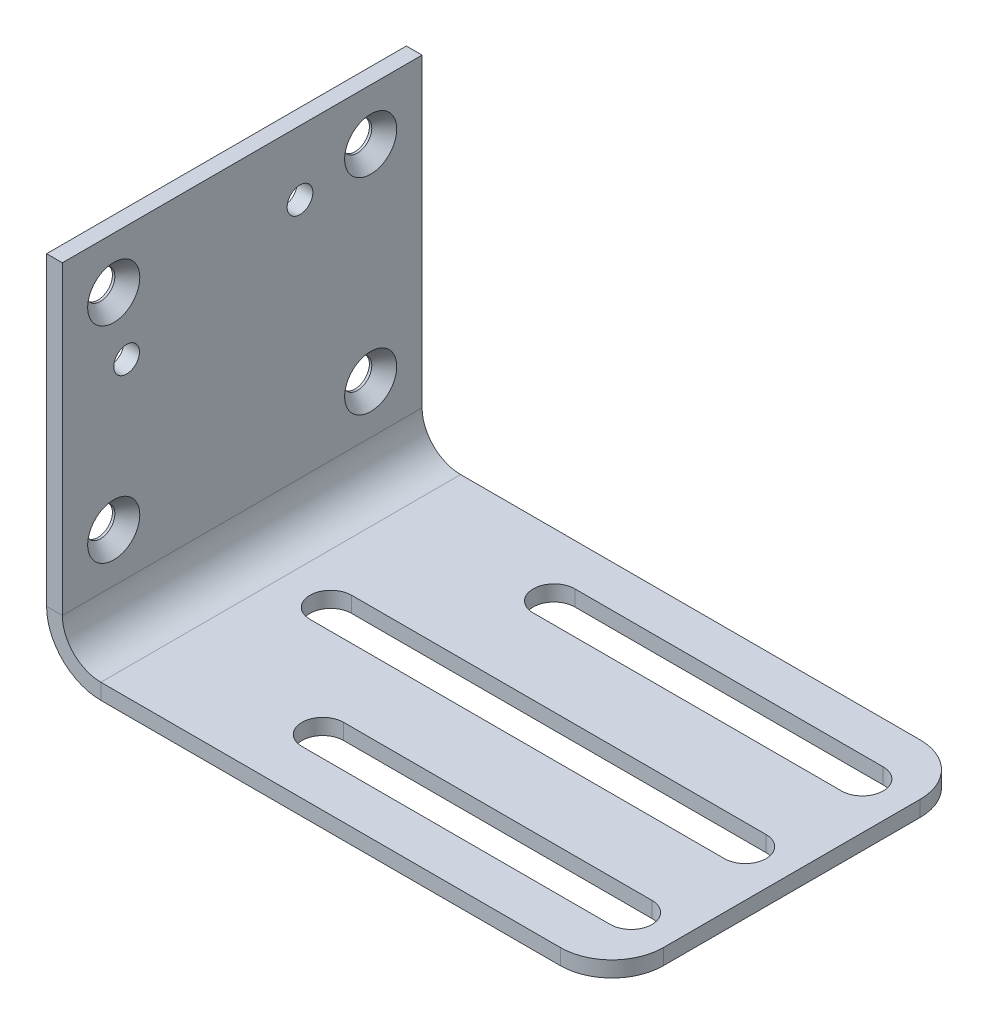
ISO-10303-21;
HEADER;
FILE_DESCRIPTION(('STEP AP214'),'2;1');
FILE_NAME('part.step','',(''),(''),'','','');
FILE_SCHEMA(('AUTOMOTIVE_DESIGN { 1 0 10303 214 1 1 1 1 }'));
ENDSEC;
DATA;
#1=APPLICATION_CONTEXT('core data for automotive mechanical design processes');
#2=APPLICATION_PROTOCOL_DEFINITION('international standard','automotive_design',2000,#1);
#3=PRODUCT_CONTEXT('',#1,'mechanical');
#4=PRODUCT('Part','Part','',(#3));
#5=PRODUCT_RELATED_PRODUCT_CATEGORY('part','',(#4));
#6=PRODUCT_DEFINITION_FORMATION('','',#4);
#7=PRODUCT_DEFINITION_CONTEXT('part definition',#1,'design');
#8=PRODUCT_DEFINITION('design','',#6,#7);
#9=PRODUCT_DEFINITION_SHAPE('','',#8);
#10=(LENGTH_UNIT() NAMED_UNIT(*) SI_UNIT(.MILLI.,.METRE.));
#11=(NAMED_UNIT(*) PLANE_ANGLE_UNIT() SI_UNIT($,.RADIAN.));
#12=(NAMED_UNIT(*) SI_UNIT($,.STERADIAN.) SOLID_ANGLE_UNIT());
#13=UNCERTAINTY_MEASURE_WITH_UNIT(LENGTH_MEASURE(1.E-05),#10,'distance_accuracy_value','');
#14=(GEOMETRIC_REPRESENTATION_CONTEXT(3) GLOBAL_UNCERTAINTY_ASSIGNED_CONTEXT((#13)) GLOBAL_UNIT_ASSIGNED_CONTEXT((#10,
#11,#12)) REPRESENTATION_CONTEXT('',''));
#15=CARTESIAN_POINT('',(0.,0.,0.));
#16=DIRECTION('',(0.,0.,1.));
#17=DIRECTION('',(1.,0.,0.));
#18=AXIS2_PLACEMENT_3D('',#15,#16,#17);
#19=CARTESIAN_POINT('',(0.,13.41628,44.45));
#20=DIRECTION('',(0.,0.,1.));
#21=DIRECTION('',(1.,0.,0.));
#22=AXIS2_PLACEMENT_3D('',#19,#20,#21);
#23=PLANE('',#22);
#24=DIRECTION('',(1.,0.,0.));
#25=VECTOR('',#24,1.);
#26=CARTESIAN_POINT('',(0.,13.41628,44.45));
#27=LINE('',#26,#25);
#28=CARTESIAN_POINT('',(0.,13.41628,44.45));
#29=VERTEX_POINT('',#28);
#30=CARTESIAN_POINT('',(3.89128,13.41628,44.45));
#31=VERTEX_POINT('',#30);
#32=EDGE_CURVE('E370',#29,#31,#27,.T.);
#33=ORIENTED_EDGE('',*,*,#32,.F.);
#34=CARTESIAN_POINT('',(13.41628,13.41628,44.45));
#35=DIRECTION('',(0.,0.,-1.));
#36=DIRECTION('',(-1.,0.,0.));
#37=AXIS2_PLACEMENT_3D('',#34,#35,#36);
#38=CIRCLE('',#37,13.41628);
#39=CARTESIAN_POINT('',(13.41628,0.,44.45));
#40=VERTEX_POINT('',#39);
#41=EDGE_CURVE('E322',#29,#40,#38,.F.);
#42=ORIENTED_EDGE('',*,*,#41,.T.);
#43=DIRECTION('',(0.,-1.,0.));
#44=VECTOR('',#43,1.);
#45=CARTESIAN_POINT('',(13.41628,3.89128,44.45));
#46=LINE('',#45,#44);
#47=CARTESIAN_POINT('',(13.41628,3.89128,44.45));
#48=VERTEX_POINT('',#47);
#49=EDGE_CURVE('E368',#48,#40,#46,.T.);
#50=ORIENTED_EDGE('',*,*,#49,.F.);
#51=CARTESIAN_POINT('',(13.41628,13.41628,44.45));
#52=DIRECTION('',(0.,0.,1.));
#53=DIRECTION('',(1.,0.,0.));
#54=AXIS2_PLACEMENT_3D('',#51,#52,#53);
#55=CIRCLE('',#54,9.525);
#56=EDGE_CURVE('E310',#31,#48,#55,.T.);
#57=ORIENTED_EDGE('',*,*,#56,.F.);
#58=EDGE_LOOP('',(#33,#42,#50,#57));
#59=FACE_BOUND('',#58,.T.);
#60=ADVANCED_FACE('F43',(#59),#23,.T.);
#61=CARTESIAN_POINT('',(13.41628,3.89128,44.45));
#62=DIRECTION('',(0.,0.,1.));
#63=DIRECTION('',(1.,0.,0.));
#64=AXIS2_PLACEMENT_3D('',#61,#62,#63);
#65=PLANE('',#64);
#66=DIRECTION('',(0.,-1.,0.));
#67=VECTOR('',#66,1.);
#68=CARTESIAN_POINT('',(0.,0.,44.45));
#69=LINE('',#68,#67);
#70=CARTESIAN_POINT('',(0.,88.9,44.45));
#71=VERTEX_POINT('',#70);
#72=EDGE_CURVE('E319',#71,#29,#69,.T.);
#73=ORIENTED_EDGE('',*,*,#72,.T.);
#74=ORIENTED_EDGE('',*,*,#32,.T.);
#75=DIRECTION('',(0.,1.,0.));
#76=VECTOR('',#75,1.);
#77=CARTESIAN_POINT('',(3.89128,0.,44.45));
#78=LINE('',#77,#76);
#79=CARTESIAN_POINT('',(3.89128,88.9,44.45));
#80=VERTEX_POINT('',#79);
#81=EDGE_CURVE('E313',#80,#31,#78,.F.);
#82=ORIENTED_EDGE('',*,*,#81,.F.);
#83=DIRECTION('',(1.,0.,0.));
#84=VECTOR('',#83,1.);
#85=CARTESIAN_POINT('',(0.,88.9,44.45));
#86=LINE('',#85,#84);
#87=EDGE_CURVE('E316',#71,#80,#86,.T.);
#88=ORIENTED_EDGE('',*,*,#87,.F.);
#89=EDGE_LOOP('',(#73,#74,#82,#88));
#90=FACE_BOUND('',#89,.T.);
#91=ADVANCED_FACE('F446',(#90),#65,.T.);
#92=CARTESIAN_POINT('',(13.41628,0.,-44.45));
#93=DIRECTION('',(0.,0.,-1.));
#94=DIRECTION('',(-1.,0.,0.));
#95=AXIS2_PLACEMENT_3D('',#92,#93,#94);
#96=PLANE('',#95);
#97=DIRECTION('',(0.,1.,0.));
#98=VECTOR('',#97,1.);
#99=CARTESIAN_POINT('',(13.41628,0.,-44.45));
#100=LINE('',#99,#98);
#101=CARTESIAN_POINT('',(13.41628,0.,-44.45));
#102=VERTEX_POINT('',#101);
#103=CARTESIAN_POINT('',(13.41628,3.89128,-44.45));
#104=VERTEX_POINT('',#103);
#105=EDGE_CURVE('E366',#102,#104,#100,.T.);
#106=ORIENTED_EDGE('',*,*,#105,.F.);
#107=CARTESIAN_POINT('',(13.41628,13.41628,-44.45));
#108=DIRECTION('',(0.,0.,-1.));
#109=DIRECTION('',(-1.,0.,0.));
#110=AXIS2_PLACEMENT_3D('',#107,#108,#109);
#111=CIRCLE('',#110,13.41628);
#112=CARTESIAN_POINT('',(0.,13.41628,-44.45));
#113=VERTEX_POINT('',#112);
#114=EDGE_CURVE('E308',#113,#102,#111,.F.);
#115=ORIENTED_EDGE('',*,*,#114,.F.);
#116=DIRECTION('',(-1.,0.,0.));
#117=VECTOR('',#116,1.);
#118=CARTESIAN_POINT('',(3.89128,13.41628,-44.45));
#119=LINE('',#118,#117);
#120=CARTESIAN_POINT('',(3.89128,13.41628,-44.45));
#121=VERTEX_POINT('',#120);
#122=EDGE_CURVE('E364',#121,#113,#119,.T.);
#123=ORIENTED_EDGE('',*,*,#122,.F.);
#124=CARTESIAN_POINT('',(13.41628,13.41628,-44.45));
#125=DIRECTION('',(0.,0.,1.));
#126=DIRECTION('',(1.,0.,0.));
#127=AXIS2_PLACEMENT_3D('',#124,#125,#126);
#128=CIRCLE('',#127,9.525);
#129=EDGE_CURVE('E331',#121,#104,#128,.T.);
#130=ORIENTED_EDGE('',*,*,#129,.T.);
#131=EDGE_LOOP('',(#106,#115,#123,#130));
#132=FACE_BOUND('',#131,.T.);
#133=ADVANCED_FACE('F430',(#132),#96,.T.);
#134=CARTESIAN_POINT('',(3.89128,13.41628,-44.45));
#135=DIRECTION('',(0.,0.,-1.));
#136=DIRECTION('',(-1.,0.,0.));
#137=AXIS2_PLACEMENT_3D('',#134,#135,#136);
#138=PLANE('',#137);
#139=DIRECTION('',(1.,0.,0.));
#140=VECTOR('',#139,1.);
#141=CARTESIAN_POINT('',(0.,3.89128,-44.45));
#142=LINE('',#141,#140);
#143=CARTESIAN_POINT('',(127.,3.89128,-44.45));
#144=VERTEX_POINT('',#143);
#145=EDGE_CURVE('E328',#104,#144,#142,.T.);
#146=ORIENTED_EDGE('',*,*,#145,.T.);
#147=DIRECTION('',(0.,-1.,0.));
#148=VECTOR('',#147,1.);
#149=CARTESIAN_POINT('',(127.,13.4162800000018,-44.45));
#150=LINE('',#149,#148);
#151=CARTESIAN_POINT('',(127.,0.,-44.45));
#152=VERTEX_POINT('',#151);
#153=EDGE_CURVE('E390',#144,#152,#150,.T.);
#154=ORIENTED_EDGE('',*,*,#153,.T.);
#155=DIRECTION('',(1.,0.,0.));
#156=VECTOR('',#155,1.);
#157=CARTESIAN_POINT('',(0.,0.,-44.45));
#158=LINE('',#157,#156);
#159=EDGE_CURVE('E298',#102,#152,#158,.T.);
#160=ORIENTED_EDGE('',*,*,#159,.F.);
#161=ORIENTED_EDGE('',*,*,#105,.T.);
#162=EDGE_LOOP('',(#146,#154,#160,#161));
#163=FACE_BOUND('',#162,.T.);
#164=ADVANCED_FACE('F410',(#163),#138,.T.);
#165=CARTESIAN_POINT('',(0.,0.,44.45));
#166=DIRECTION('',(0.,1.,0.));
#167=DIRECTION('',(0.,0.,1.));
#168=AXIS2_PLACEMENT_3D('',#165,#166,#167);
#169=PLANE('',#168);
#170=DIRECTION('',(-1.,0.,0.));
#171=VECTOR('',#170,1.);
#172=CARTESIAN_POINT('',(51.9937999999999,0.,-34.1122));
#173=LINE('',#172,#171);
#174=CARTESIAN_POINT('',(128.1938,0.,-34.1122));
#175=VERTEX_POINT('',#174);
#176=CARTESIAN_POINT('',(51.9937999999999,0.,-34.1122));
#177=VERTEX_POINT('',#176);
#178=EDGE_CURVE('E206',#175,#177,#173,.T.);
#179=ORIENTED_EDGE('',*,*,#178,.T.);
#180=CARTESIAN_POINT('',(51.9937999999999,0.,-28.956));
#181=DIRECTION('',(0.,1.,0.));
#182=DIRECTION('',(0.,0.,1.));
#183=AXIS2_PLACEMENT_3D('',#180,#181,#182);
#184=CIRCLE('',#183,5.1562);
#185=CARTESIAN_POINT('',(51.9937999999999,0.,-23.7998));
#186=VERTEX_POINT('',#185);
#187=EDGE_CURVE('E198',#177,#186,#184,.T.);
#188=ORIENTED_EDGE('',*,*,#187,.T.);
#189=DIRECTION('',(1.,0.,0.));
#190=VECTOR('',#189,1.);
#191=CARTESIAN_POINT('',(51.9937999999999,0.,-23.7998));
#192=LINE('',#191,#190);
#193=CARTESIAN_POINT('',(128.1938,0.,-23.7998));
#194=VERTEX_POINT('',#193);
#195=EDGE_CURVE('E210',#186,#194,#192,.T.);
#196=ORIENTED_EDGE('',*,*,#195,.T.);
#197=CARTESIAN_POINT('',(128.1938,0.,-28.956));
#198=DIRECTION('',(0.,1.,0.));
#199=DIRECTION('',(0.,0.,1.));
#200=AXIS2_PLACEMENT_3D('',#197,#198,#199);
#201=CIRCLE('',#200,5.1562);
#202=EDGE_CURVE('E214',#194,#175,#201,.T.);
#203=ORIENTED_EDGE('',*,*,#202,.T.);
#204=EDGE_LOOP('',(#179,#188,#196,#203));
#205=FACE_BOUND('',#204,.T.);
#206=DIRECTION('',(-1.,0.,0.));
#207=VECTOR('',#206,1.);
#208=CARTESIAN_POINT('',(51.9937999999999,0.,23.0378));
#209=LINE('',#208,#207);
#210=CARTESIAN_POINT('',(128.1938,0.,23.0378));
#211=VERTEX_POINT('',#210);
#212=CARTESIAN_POINT('',(51.9937999999999,0.,23.0378));
#213=VERTEX_POINT('',#212);
#214=EDGE_CURVE('E251',#211,#213,#209,.T.);
#215=ORIENTED_EDGE('',*,*,#214,.T.);
#216=CARTESIAN_POINT('',(51.9937999999999,0.,28.194));
#217=DIRECTION('',(0.,1.,0.));
#218=DIRECTION('',(0.,0.,1.));
#219=AXIS2_PLACEMENT_3D('',#216,#217,#218);
#220=CIRCLE('',#219,5.1562);
#221=CARTESIAN_POINT('',(51.9937999999999,0.,33.3502));
#222=VERTEX_POINT('',#221);
#223=EDGE_CURVE('E241',#213,#222,#220,.T.);
#224=ORIENTED_EDGE('',*,*,#223,.T.);
#225=DIRECTION('',(1.,0.,0.));
#226=VECTOR('',#225,1.);
#227=CARTESIAN_POINT('',(51.9937999999999,0.,33.3502));
#228=LINE('',#227,#226);
#229=CARTESIAN_POINT('',(128.1938,0.,33.3502));
#230=VERTEX_POINT('',#229);
#231=EDGE_CURVE('E244',#222,#230,#228,.T.);
#232=ORIENTED_EDGE('',*,*,#231,.T.);
#233=CARTESIAN_POINT('',(128.1938,0.,28.194));
#234=DIRECTION('',(0.,1.,0.));
#235=DIRECTION('',(0.,0.,1.));
#236=AXIS2_PLACEMENT_3D('',#233,#234,#235);
#237=CIRCLE('',#236,5.1562);
#238=EDGE_CURVE('E248',#230,#211,#237,.T.);
#239=ORIENTED_EDGE('',*,*,#238,.T.);
#240=EDGE_LOOP('',(#215,#224,#232,#239));
#241=FACE_BOUND('',#240,.T.);
#242=DIRECTION('',(-1.,0.,0.));
#243=VECTOR('',#242,1.);
#244=CARTESIAN_POINT('',(25.7809999999999,0.,-5.1562));
#245=LINE('',#244,#243);
#246=CARTESIAN_POINT('',(128.1938,0.,-5.1562));
#247=VERTEX_POINT('',#246);
#248=CARTESIAN_POINT('',(25.7809999999999,0.,-5.1562));
#249=VERTEX_POINT('',#248);
#250=EDGE_CURVE('E283',#247,#249,#245,.T.);
#251=ORIENTED_EDGE('',*,*,#250,.T.);
#252=CARTESIAN_POINT('',(25.7809999999999,0.,0.));
#253=DIRECTION('',(0.,1.,0.));
#254=DIRECTION('',(0.,0.,1.));
#255=AXIS2_PLACEMENT_3D('',#252,#253,#254);
#256=CIRCLE('',#255,5.1562);
#257=CARTESIAN_POINT('',(25.7809999999999,0.,5.1562));
#258=VERTEX_POINT('',#257);
#259=EDGE_CURVE('E273',#249,#258,#256,.T.);
#260=ORIENTED_EDGE('',*,*,#259,.T.);
#261=DIRECTION('',(1.,0.,0.));
#262=VECTOR('',#261,1.);
#263=CARTESIAN_POINT('',(25.7809999999999,0.,5.1562));
#264=LINE('',#263,#262);
#265=CARTESIAN_POINT('',(128.1938,0.,5.1562));
#266=VERTEX_POINT('',#265);
#267=EDGE_CURVE('E276',#258,#266,#264,.T.);
#268=ORIENTED_EDGE('',*,*,#267,.T.);
#269=CARTESIAN_POINT('',(128.1938,0.,0.));
#270=DIRECTION('',(0.,1.,0.));
#271=DIRECTION('',(0.,0.,1.));
#272=AXIS2_PLACEMENT_3D('',#269,#270,#271);
#273=CIRCLE('',#272,5.1562);
#274=EDGE_CURVE('E280',#266,#247,#273,.T.);
#275=ORIENTED_EDGE('',*,*,#274,.T.);
#276=EDGE_LOOP('',(#251,#260,#268,#275));
#277=FACE_BOUND('',#276,.T.);
#278=ORIENTED_EDGE('',*,*,#159,.T.);
#279=CARTESIAN_POINT('',(127.,0.,-31.75));
#280=DIRECTION('',(0.,1.,0.));
#281=DIRECTION('',(0.,0.,1.));
#282=AXIS2_PLACEMENT_3D('',#279,#280,#281);
#283=CIRCLE('',#282,12.7);
#284=CARTESIAN_POINT('',(139.7,0.,-31.75));
#285=VERTEX_POINT('',#284);
#286=EDGE_CURVE('E395',#152,#285,#283,.F.);
#287=ORIENTED_EDGE('',*,*,#286,.T.);
#288=DIRECTION('',(0.,0.,-1.));
#289=VECTOR('',#288,1.);
#290=CARTESIAN_POINT('',(139.7,0.,44.45));
#291=LINE('',#290,#289);
#292=CARTESIAN_POINT('',(139.7,0.,31.75));
#293=VERTEX_POINT('',#292);
#294=EDGE_CURVE('E362',#293,#285,#291,.T.);
#295=ORIENTED_EDGE('',*,*,#294,.F.);
#296=CARTESIAN_POINT('',(127.,0.,31.75));
#297=DIRECTION('',(0.,1.,0.));
#298=DIRECTION('',(0.,0.,1.));
#299=AXIS2_PLACEMENT_3D('',#296,#297,#298);
#300=CIRCLE('',#299,12.7);
#301=CARTESIAN_POINT('',(127.,0.,44.45));
#302=VERTEX_POINT('',#301);
#303=EDGE_CURVE('E393',#293,#302,#300,.F.);
#304=ORIENTED_EDGE('',*,*,#303,.T.);
#305=DIRECTION('',(1.,0.,0.));
#306=VECTOR('',#305,1.);
#307=CARTESIAN_POINT('',(0.,0.,44.45));
#308=LINE('',#307,#306);
#309=EDGE_CURVE('E305',#40,#302,#308,.T.);
#310=ORIENTED_EDGE('',*,*,#309,.F.);
#311=DIRECTION('',(0.,0.,-1.));
#312=VECTOR('',#311,1.);
#313=CARTESIAN_POINT('',(13.41628,0.,44.45));
#314=LINE('',#313,#312);
#315=EDGE_CURVE('E325',#40,#102,#314,.T.);
#316=ORIENTED_EDGE('',*,*,#315,.T.);
#317=EDGE_LOOP('',(#278,#287,#295,#304,#310,#316));
#318=FACE_BOUND('',#317,.T.);
#319=ADVANCED_FACE('F216',(#205,#241,#277,#318),#169,.F.);
#320=CARTESIAN_POINT('',(139.7,3.89128,44.45));
#321=DIRECTION('',(1.,0.,0.));
#322=DIRECTION('',(0.,1.,0.));
#323=AXIS2_PLACEMENT_3D('',#320,#321,#322);
#324=PLANE('',#323);
#325=ORIENTED_EDGE('',*,*,#294,.T.);
#326=DIRECTION('',(0.,-1.,0.));
#327=VECTOR('',#326,1.);
#328=CARTESIAN_POINT('',(139.7,3.89128,-31.75));
#329=LINE('',#328,#327);
#330=CARTESIAN_POINT('',(139.7,3.89128,-31.75));
#331=VERTEX_POINT('',#330);
#332=EDGE_CURVE('E64',#285,#331,#329,.F.);
#333=ORIENTED_EDGE('',*,*,#332,.T.);
#334=DIRECTION('',(0.,0.,-1.));
#335=VECTOR('',#334,1.);
#336=CARTESIAN_POINT('',(139.7,3.89128,44.45));
#337=LINE('',#336,#335);
#338=CARTESIAN_POINT('',(139.7,3.89128,31.75));
#339=VERTEX_POINT('',#338);
#340=EDGE_CURVE('E360',#339,#331,#337,.T.);
#341=ORIENTED_EDGE('',*,*,#340,.F.);
#342=DIRECTION('',(0.,-1.,0.));
#343=VECTOR('',#342,1.);
#344=CARTESIAN_POINT('',(139.7,3.89128,31.75));
#345=LINE('',#344,#343);
#346=EDGE_CURVE('E397',#339,#293,#345,.T.);
#347=ORIENTED_EDGE('',*,*,#346,.T.);
#348=EDGE_LOOP('',(#325,#333,#341,#347));
#349=FACE_BOUND('',#348,.T.);
#350=ADVANCED_FACE('F415',(#349),#324,.T.);
#351=CARTESIAN_POINT('',(0.,3.89128,44.45));
#352=DIRECTION('',(0.,1.,0.));
#353=DIRECTION('',(0.,0.,1.));
#354=AXIS2_PLACEMENT_3D('',#351,#352,#353);
#355=PLANE('',#354);
#356=CARTESIAN_POINT('',(51.9937999999999,3.89128,-28.956));
#357=DIRECTION('',(0.,1.,0.));
#358=DIRECTION('',(0.,0.,1.));
#359=AXIS2_PLACEMENT_3D('',#356,#357,#358);
#360=CIRCLE('',#359,5.1562);
#361=CARTESIAN_POINT('',(51.9937999999999,3.89128,-34.1122));
#362=VERTEX_POINT('',#361);
#363=CARTESIAN_POINT('',(51.9937999999999,3.89128,-23.7998));
#364=VERTEX_POINT('',#363);
#365=EDGE_CURVE('E201',#362,#364,#360,.T.);
#366=ORIENTED_EDGE('',*,*,#365,.F.);
#367=DIRECTION('',(-1.,0.,0.));
#368=VECTOR('',#367,1.);
#369=CARTESIAN_POINT('',(51.9937999999999,3.89128,-34.1122));
#370=LINE('',#369,#368);
#371=CARTESIAN_POINT('',(128.1938,3.89128,-34.1122));
#372=VERTEX_POINT('',#371);
#373=EDGE_CURVE('E219',#372,#362,#370,.T.);
#374=ORIENTED_EDGE('',*,*,#373,.F.);
#375=CARTESIAN_POINT('',(128.1938,3.89128,-28.956));
#376=DIRECTION('',(0.,1.,0.));
#377=DIRECTION('',(0.,0.,1.));
#378=AXIS2_PLACEMENT_3D('',#375,#376,#377);
#379=CIRCLE('',#378,5.1562);
#380=CARTESIAN_POINT('',(128.1938,3.89128,-23.7998));
#381=VERTEX_POINT('',#380);
#382=EDGE_CURVE('E222',#381,#372,#379,.T.);
#383=ORIENTED_EDGE('',*,*,#382,.F.);
#384=DIRECTION('',(1.,0.,0.));
#385=VECTOR('',#384,1.);
#386=CARTESIAN_POINT('',(51.9937999999999,3.89128,-23.7998));
#387=LINE('',#386,#385);
#388=EDGE_CURVE('E231',#364,#381,#387,.T.);
#389=ORIENTED_EDGE('',*,*,#388,.F.);
#390=EDGE_LOOP('',(#366,#374,#383,#389));
#391=FACE_BOUND('',#390,.T.);
#392=CARTESIAN_POINT('',(51.9937999999999,3.89128,28.194));
#393=DIRECTION('',(0.,1.,0.));
#394=DIRECTION('',(0.,0.,1.));
#395=AXIS2_PLACEMENT_3D('',#392,#393,#394);
#396=CIRCLE('',#395,5.1562);
#397=CARTESIAN_POINT('',(51.9937999999999,3.89128,23.0378));
#398=VERTEX_POINT('',#397);
#399=CARTESIAN_POINT('',(51.9937999999999,3.89128,33.3502));
#400=VERTEX_POINT('',#399);
#401=EDGE_CURVE('E237',#398,#400,#396,.T.);
#402=ORIENTED_EDGE('',*,*,#401,.F.);
#403=DIRECTION('',(-1.,0.,0.));
#404=VECTOR('',#403,1.);
#405=CARTESIAN_POINT('',(51.9937999999999,3.89128,23.0378));
#406=LINE('',#405,#404);
#407=CARTESIAN_POINT('',(128.1938,3.89128,23.0378));
#408=VERTEX_POINT('',#407);
#409=EDGE_CURVE('E245',#408,#398,#406,.T.);
#410=ORIENTED_EDGE('',*,*,#409,.F.);
#411=CARTESIAN_POINT('',(128.1938,3.89128,28.194));
#412=DIRECTION('',(0.,1.,0.));
#413=DIRECTION('',(0.,0.,1.));
#414=AXIS2_PLACEMENT_3D('',#411,#412,#413);
#415=CIRCLE('',#414,5.1562);
#416=CARTESIAN_POINT('',(128.1938,3.89128,33.3502));
#417=VERTEX_POINT('',#416);
#418=EDGE_CURVE('E259',#417,#408,#415,.T.);
#419=ORIENTED_EDGE('',*,*,#418,.F.);
#420=DIRECTION('',(1.,0.,0.));
#421=VECTOR('',#420,1.);
#422=CARTESIAN_POINT('',(51.9937999999999,3.89128,33.3502));
#423=LINE('',#422,#421);
#424=EDGE_CURVE('E256',#400,#417,#423,.T.);
#425=ORIENTED_EDGE('',*,*,#424,.F.);
#426=EDGE_LOOP('',(#402,#410,#419,#425));
#427=FACE_BOUND('',#426,.T.);
#428=CARTESIAN_POINT('',(25.7809999999999,3.89128,0.));
#429=DIRECTION('',(0.,1.,0.));
#430=DIRECTION('',(0.,0.,1.));
#431=AXIS2_PLACEMENT_3D('',#428,#429,#430);
#432=CIRCLE('',#431,5.1562);
#433=CARTESIAN_POINT('',(25.7809999999999,3.89128,-5.1562));
#434=VERTEX_POINT('',#433);
#435=CARTESIAN_POINT('',(25.7809999999999,3.89128,5.1562));
#436=VERTEX_POINT('',#435);
#437=EDGE_CURVE('E266',#434,#436,#432,.T.);
#438=ORIENTED_EDGE('',*,*,#437,.F.);
#439=DIRECTION('',(-1.,0.,0.));
#440=VECTOR('',#439,1.);
#441=CARTESIAN_POINT('',(25.7809999999999,3.89128,-5.1562));
#442=LINE('',#441,#440);
#443=CARTESIAN_POINT('',(128.1938,3.89128,-5.1562));
#444=VERTEX_POINT('',#443);
#445=EDGE_CURVE('E277',#444,#434,#442,.T.);
#446=ORIENTED_EDGE('',*,*,#445,.F.);
#447=CARTESIAN_POINT('',(128.1938,3.89128,0.));
#448=DIRECTION('',(0.,1.,0.));
#449=DIRECTION('',(0.,0.,1.));
#450=AXIS2_PLACEMENT_3D('',#447,#448,#449);
#451=CIRCLE('',#450,5.1562);
#452=CARTESIAN_POINT('',(128.1938,3.89128,5.1562));
#453=VERTEX_POINT('',#452);
#454=EDGE_CURVE('E291',#453,#444,#451,.T.);
#455=ORIENTED_EDGE('',*,*,#454,.F.);
#456=DIRECTION('',(1.,0.,0.));
#457=VECTOR('',#456,1.);
#458=CARTESIAN_POINT('',(25.7809999999999,3.89128,5.1562));
#459=LINE('',#458,#457);
#460=EDGE_CURVE('E288',#436,#453,#459,.T.);
#461=ORIENTED_EDGE('',*,*,#460,.F.);
#462=EDGE_LOOP('',(#438,#446,#455,#461));
#463=FACE_BOUND('',#462,.T.);
#464=ORIENTED_EDGE('',*,*,#340,.T.);
#465=CARTESIAN_POINT('',(127.,3.89128,-31.75));
#466=DIRECTION('',(0.,1.,0.));
#467=DIRECTION('',(0.,0.,1.));
#468=AXIS2_PLACEMENT_3D('',#465,#466,#467);
#469=CIRCLE('',#468,12.7);
#470=EDGE_CURVE('E51',#331,#144,#469,.T.);
#471=ORIENTED_EDGE('',*,*,#470,.T.);
#472=ORIENTED_EDGE('',*,*,#145,.F.);
#473=DIRECTION('',(0.,0.,-1.));
#474=VECTOR('',#473,1.);
#475=CARTESIAN_POINT('',(13.41628,3.89128,44.45));
#476=LINE('',#475,#474);
#477=EDGE_CURVE('E357',#48,#104,#476,.T.);
#478=ORIENTED_EDGE('',*,*,#477,.F.);
#479=DIRECTION('',(1.,0.,0.));
#480=VECTOR('',#479,1.);
#481=CARTESIAN_POINT('',(0.,3.89128,44.45));
#482=LINE('',#481,#480);
#483=CARTESIAN_POINT('',(127.,3.89128,44.45));
#484=VERTEX_POINT('',#483);
#485=EDGE_CURVE('E307',#48,#484,#482,.T.);
#486=ORIENTED_EDGE('',*,*,#485,.T.);
#487=CARTESIAN_POINT('',(127.,3.89128,31.75));
#488=DIRECTION('',(0.,1.,0.));
#489=DIRECTION('',(0.,0.,1.));
#490=AXIS2_PLACEMENT_3D('',#487,#488,#489);
#491=CIRCLE('',#490,12.7);
#492=EDGE_CURVE('E401',#484,#339,#491,.T.);
#493=ORIENTED_EDGE('',*,*,#492,.T.);
#494=EDGE_LOOP('',(#464,#471,#472,#478,#486,#493));
#495=FACE_BOUND('',#494,.T.);
#496=ADVANCED_FACE('F405',(#391,#427,#463,#495),#355,.T.);
#497=CARTESIAN_POINT('',(13.41628,13.41628,44.45));
#498=DIRECTION('',(0.,0.,-1.));
#499=DIRECTION('',(-1.,0.,0.));
#500=AXIS2_PLACEMENT_3D('',#497,#498,#499);
#501=CYLINDRICAL_SURFACE('',#500,9.525);
#502=ORIENTED_EDGE('',*,*,#129,.F.);
#503=DIRECTION('',(0.,0.,-1.));
#504=VECTOR('',#503,1.);
#505=CARTESIAN_POINT('',(3.89128,13.41628,44.45));
#506=LINE('',#505,#504);
#507=EDGE_CURVE('E354',#31,#121,#506,.T.);
#508=ORIENTED_EDGE('',*,*,#507,.F.);
#509=ORIENTED_EDGE('',*,*,#56,.T.);
#510=ORIENTED_EDGE('',*,*,#477,.T.);
#511=EDGE_LOOP('',(#502,#508,#509,#510));
#512=FACE_BOUND('',#511,.T.);
#513=ADVANCED_FACE('F434',(#512),#501,.F.);
#514=CARTESIAN_POINT('',(3.89128,0.,44.45));
#515=DIRECTION('',(1.,0.,0.));
#516=DIRECTION('',(0.,0.,-1.));
#517=AXIS2_PLACEMENT_3D('',#514,#515,#516);
#518=PLANE('',#517);
#519=CARTESIAN_POINT('',(3.89128,60.325,28.575));
#520=DIRECTION('',(1.,0.,0.));
#521=DIRECTION('',(0.,0.,-1.));
#522=AXIS2_PLACEMENT_3D('',#519,#520,#521);
#523=CIRCLE('',#522,3.17499999999998);
#524=CARTESIAN_POINT('',(3.89128,60.325,25.4));
#525=VERTEX_POINT('',#524);
#526=EDGE_CURVE('E911',#525,#525,#523,.T.);
#527=ORIENTED_EDGE('',*,*,#526,.F.);
#528=EDGE_LOOP('',(#527));
#529=FACE_BOUND('',#528,.T.);
#530=CARTESIAN_POINT('',(3.89128,73.025,-14.2748));
#531=DIRECTION('',(1.,0.,0.));
#532=DIRECTION('',(0.,0.,-1.));
#533=AXIS2_PLACEMENT_3D('',#530,#531,#532);
#534=CIRCLE('',#533,3.17499999999998);
#535=CARTESIAN_POINT('',(3.89128,73.025,-17.4498));
#536=VERTEX_POINT('',#535);
#537=EDGE_CURVE('E905',#536,#536,#534,.T.);
#538=ORIENTED_EDGE('',*,*,#537,.F.);
#539=EDGE_LOOP('',(#538));
#540=FACE_BOUND('',#539,.T.);
#541=CARTESIAN_POINT('',(3.89128,76.2,-31.75));
#542=DIRECTION('',(1.,0.,0.));
#543=DIRECTION('',(0.,0.,-1.));
#544=AXIS2_PLACEMENT_3D('',#541,#542,#543);
#545=CIRCLE('',#544,6.4389);
#546=CARTESIAN_POINT('',(3.89128,76.2,-38.1889));
#547=VERTEX_POINT('',#546);
#548=EDGE_CURVE('E899',#547,#547,#545,.T.);
#549=ORIENTED_EDGE('',*,*,#548,.F.);
#550=EDGE_LOOP('',(#549));
#551=FACE_BOUND('',#550,.T.);
#552=CARTESIAN_POINT('',(3.89128,76.2,31.75));
#553=DIRECTION('',(1.,0.,0.));
#554=DIRECTION('',(0.,0.,-1.));
#555=AXIS2_PLACEMENT_3D('',#552,#553,#554);
#556=CIRCLE('',#555,6.4389);
#557=CARTESIAN_POINT('',(3.89128,76.2,25.3111));
#558=VERTEX_POINT('',#557);
#559=EDGE_CURVE('E889',#558,#558,#556,.T.);
#560=ORIENTED_EDGE('',*,*,#559,.F.);
#561=EDGE_LOOP('',(#560));
#562=FACE_BOUND('',#561,.T.);
#563=DIRECTION('',(0.,1.,0.));
#564=VECTOR('',#563,1.);
#565=CARTESIAN_POINT('',(3.89128,0.,-44.45));
#566=LINE('',#565,#564);
#567=CARTESIAN_POINT('',(3.89128,88.9,-44.45));
#568=VERTEX_POINT('',#567);
#569=EDGE_CURVE('E334',#568,#121,#566,.F.);
#570=ORIENTED_EDGE('',*,*,#569,.F.);
#571=DIRECTION('',(0.,0.,-1.));
#572=VECTOR('',#571,1.);
#573=CARTESIAN_POINT('',(3.89128,88.9,44.45));
#574=LINE('',#573,#572);
#575=EDGE_CURVE('E352',#80,#568,#574,.T.);
#576=ORIENTED_EDGE('',*,*,#575,.F.);
#577=ORIENTED_EDGE('',*,*,#81,.T.);
#578=ORIENTED_EDGE('',*,*,#507,.T.);
#579=EDGE_LOOP('',(#570,#576,#577,#578));
#580=FACE_BOUND('',#579,.T.);
#581=CARTESIAN_POINT('',(3.89128,25.4,31.75));
#582=DIRECTION('',(1.,0.,0.));
#583=DIRECTION('',(0.,0.,-1.));
#584=AXIS2_PLACEMENT_3D('',#581,#582,#583);
#585=CIRCLE('',#584,6.4389);
#586=CARTESIAN_POINT('',(3.89128,25.4,25.3111));
#587=VERTEX_POINT('',#586);
#588=EDGE_CURVE('E372',#587,#587,#585,.T.);
#589=ORIENTED_EDGE('',*,*,#588,.F.);
#590=EDGE_LOOP('',(#589));
#591=FACE_BOUND('',#590,.T.);
#592=CARTESIAN_POINT('',(3.89128,25.4,-31.75));
#593=DIRECTION('',(1.,0.,0.));
#594=DIRECTION('',(0.,0.,-1.));
#595=AXIS2_PLACEMENT_3D('',#592,#593,#594);
#596=CIRCLE('',#595,6.4389);
#597=CARTESIAN_POINT('',(3.89128,25.4,-38.1889));
#598=VERTEX_POINT('',#597);
#599=EDGE_CURVE('E381',#598,#598,#596,.T.);
#600=ORIENTED_EDGE('',*,*,#599,.F.);
#601=EDGE_LOOP('',(#600));
#602=FACE_BOUND('',#601,.T.);
#603=ADVANCED_FACE('F441',(#529,#540,#551,#562,#580,#591,#602),#518,.T.);
#604=CARTESIAN_POINT('',(0.,88.9,44.45));
#605=DIRECTION('',(0.,1.,0.));
#606=DIRECTION('',(-1.,0.,0.));
#607=AXIS2_PLACEMENT_3D('',#604,#605,#606);
#608=PLANE('',#607);
#609=DIRECTION('',(1.,0.,0.));
#610=VECTOR('',#609,1.);
#611=CARTESIAN_POINT('',(0.,88.9,-44.45));
#612=LINE('',#611,#610);
#613=CARTESIAN_POINT('',(0.,88.9,-44.45));
#614=VERTEX_POINT('',#613);
#615=EDGE_CURVE('E337',#614,#568,#612,.T.);
#616=ORIENTED_EDGE('',*,*,#615,.F.);
#617=DIRECTION('',(0.,0.,-1.));
#618=VECTOR('',#617,1.);
#619=CARTESIAN_POINT('',(0.,88.9,44.45));
#620=LINE('',#619,#618);
#621=EDGE_CURVE('E350',#71,#614,#620,.T.);
#622=ORIENTED_EDGE('',*,*,#621,.F.);
#623=ORIENTED_EDGE('',*,*,#87,.T.);
#624=ORIENTED_EDGE('',*,*,#575,.T.);
#625=EDGE_LOOP('',(#616,#622,#623,#624));
#626=FACE_BOUND('',#625,.T.);
#627=ADVANCED_FACE('F448',(#626),#608,.T.);
#628=CARTESIAN_POINT('',(0.,0.,44.45));
#629=DIRECTION('',(1.,0.,0.));
#630=DIRECTION('',(0.,0.,-1.));
#631=AXIS2_PLACEMENT_3D('',#628,#629,#630);
#632=PLANE('',#631);
#633=CARTESIAN_POINT('',(0.,60.325,28.575));
#634=DIRECTION('',(1.,0.,0.));
#635=DIRECTION('',(0.,0.,-1.));
#636=AXIS2_PLACEMENT_3D('',#633,#634,#635);
#637=CIRCLE('',#636,3.175);
#638=CARTESIAN_POINT('',(0.,60.325,25.4));
#639=VERTEX_POINT('',#638);
#640=EDGE_CURVE('E908',#639,#639,#637,.T.);
#641=ORIENTED_EDGE('',*,*,#640,.T.);
#642=EDGE_LOOP('',(#641));
#643=FACE_BOUND('',#642,.T.);
#644=CARTESIAN_POINT('',(0.,73.025,-14.2748));
#645=DIRECTION('',(1.,0.,0.));
#646=DIRECTION('',(0.,0.,-1.));
#647=AXIS2_PLACEMENT_3D('',#644,#645,#646);
#648=CIRCLE('',#647,3.175);
#649=CARTESIAN_POINT('',(0.,73.025,-17.4498));
#650=VERTEX_POINT('',#649);
#651=EDGE_CURVE('E902',#650,#650,#648,.T.);
#652=ORIENTED_EDGE('',*,*,#651,.T.);
#653=EDGE_LOOP('',(#652));
#654=FACE_BOUND('',#653,.T.);
#655=CARTESIAN_POINT('',(0.,76.2,-31.75));
#656=DIRECTION('',(1.,0.,0.));
#657=DIRECTION('',(0.,0.,-1.));
#658=AXIS2_PLACEMENT_3D('',#655,#656,#657);
#659=CIRCLE('',#658,3.57124);
#660=CARTESIAN_POINT('',(0.,76.2,-35.32124));
#661=VERTEX_POINT('',#660);
#662=EDGE_CURVE('E896',#661,#661,#659,.T.);
#663=ORIENTED_EDGE('',*,*,#662,.T.);
#664=EDGE_LOOP('',(#663));
#665=FACE_BOUND('',#664,.T.);
#666=CARTESIAN_POINT('',(0.,76.2,31.75));
#667=DIRECTION('',(1.,0.,0.));
#668=DIRECTION('',(0.,0.,-1.));
#669=AXIS2_PLACEMENT_3D('',#666,#667,#668);
#670=CIRCLE('',#669,3.57124);
#671=CARTESIAN_POINT('',(0.,76.2,28.17876));
#672=VERTEX_POINT('',#671);
#673=EDGE_CURVE('E225',#672,#672,#670,.T.);
#674=ORIENTED_EDGE('',*,*,#673,.T.);
#675=EDGE_LOOP('',(#674));
#676=FACE_BOUND('',#675,.T.);
#677=DIRECTION('',(0.,-1.,0.));
#678=VECTOR('',#677,1.);
#679=CARTESIAN_POINT('',(0.,0.,-44.45));
#680=LINE('',#679,#678);
#681=EDGE_CURVE('E340',#614,#113,#680,.T.);
#682=ORIENTED_EDGE('',*,*,#681,.T.);
#683=DIRECTION('',(0.,0.,-1.));
#684=VECTOR('',#683,1.);
#685=CARTESIAN_POINT('',(0.,13.41628,44.45));
#686=LINE('',#685,#684);
#687=EDGE_CURVE('E347',#29,#113,#686,.T.);
#688=ORIENTED_EDGE('',*,*,#687,.F.);
#689=ORIENTED_EDGE('',*,*,#72,.F.);
#690=ORIENTED_EDGE('',*,*,#621,.T.);
#691=EDGE_LOOP('',(#682,#688,#689,#690));
#692=FACE_BOUND('',#691,.T.);
#693=CARTESIAN_POINT('',(0.,25.4,31.75));
#694=DIRECTION('',(1.,0.,0.));
#695=DIRECTION('',(0.,0.,-1.));
#696=AXIS2_PLACEMENT_3D('',#693,#694,#695);
#697=CIRCLE('',#696,3.57124);
#698=CARTESIAN_POINT('',(0.,25.4,28.17876));
#699=VERTEX_POINT('',#698);
#700=EDGE_CURVE('E375',#699,#699,#697,.T.);
#701=ORIENTED_EDGE('',*,*,#700,.T.);
#702=EDGE_LOOP('',(#701));
#703=FACE_BOUND('',#702,.T.);
#704=CARTESIAN_POINT('',(0.,25.4,-31.75));
#705=DIRECTION('',(1.,0.,0.));
#706=DIRECTION('',(0.,0.,-1.));
#707=AXIS2_PLACEMENT_3D('',#704,#705,#706);
#708=CIRCLE('',#707,3.57124);
#709=CARTESIAN_POINT('',(0.,25.4,-35.32124));
#710=VERTEX_POINT('',#709);
#711=EDGE_CURVE('E384',#710,#710,#708,.T.);
#712=ORIENTED_EDGE('',*,*,#711,.T.);
#713=EDGE_LOOP('',(#712));
#714=FACE_BOUND('',#713,.T.);
#715=ADVANCED_FACE('F451',(#643,#654,#665,#676,#692,#703,#714),#632,.F.);
#716=CARTESIAN_POINT('',(13.41628,13.41628,44.45));
#717=DIRECTION('',(0.,0.,-1.));
#718=DIRECTION('',(-1.,0.,0.));
#719=AXIS2_PLACEMENT_3D('',#716,#717,#718);
#720=CYLINDRICAL_SURFACE('',#719,13.41628);
#721=ORIENTED_EDGE('',*,*,#114,.T.);
#722=ORIENTED_EDGE('',*,*,#315,.F.);
#723=ORIENTED_EDGE('',*,*,#41,.F.);
#724=ORIENTED_EDGE('',*,*,#687,.T.);
#725=EDGE_LOOP('',(#721,#722,#723,#724));
#726=FACE_BOUND('',#725,.T.);
#727=ADVANCED_FACE('F426',(#726),#720,.T.);
#728=CARTESIAN_POINT('',(13.41628,13.41628,44.45));
#729=DIRECTION('',(0.,0.,1.));
#730=DIRECTION('',(1.,0.,0.));
#731=AXIS2_PLACEMENT_3D('',#728,#729,#730);
#732=PLANE('',#731);
#733=ORIENTED_EDGE('',*,*,#309,.T.);
#734=DIRECTION('',(0.,-1.,0.));
#735=VECTOR('',#734,1.);
#736=CARTESIAN_POINT('',(127.,13.4162800000016,44.45));
#737=LINE('',#736,#735);
#738=EDGE_CURVE('E11',#302,#484,#737,.F.);
#739=ORIENTED_EDGE('',*,*,#738,.T.);
#740=ORIENTED_EDGE('',*,*,#485,.F.);
#741=ORIENTED_EDGE('',*,*,#49,.T.);
#742=EDGE_LOOP('',(#733,#739,#740,#741));
#743=FACE_BOUND('',#742,.T.);
#744=ADVANCED_FACE('F420',(#743),#732,.T.);
#745=CARTESIAN_POINT('',(13.41628,13.41628,-44.45));
#746=DIRECTION('',(0.,0.,1.));
#747=DIRECTION('',(1.,0.,0.));
#748=AXIS2_PLACEMENT_3D('',#745,#746,#747);
#749=PLANE('',#748);
#750=ORIENTED_EDGE('',*,*,#569,.T.);
#751=ORIENTED_EDGE('',*,*,#122,.T.);
#752=ORIENTED_EDGE('',*,*,#681,.F.);
#753=ORIENTED_EDGE('',*,*,#615,.T.);
#754=EDGE_LOOP('',(#750,#751,#752,#753));
#755=FACE_BOUND('',#754,.T.);
#756=ADVANCED_FACE('F437',(#755),#749,.F.);
#757=CARTESIAN_POINT('',(25.7809999999999,0.,0.));
#758=DIRECTION('',(0.,1.,0.));
#759=DIRECTION('',(0.,0.,1.));
#760=AXIS2_PLACEMENT_3D('',#757,#758,#759);
#761=CYLINDRICAL_SURFACE('',#760,5.1562);
#762=ORIENTED_EDGE('',*,*,#437,.T.);
#763=DIRECTION('',(0.,1.,0.));
#764=VECTOR('',#763,1.);
#765=CARTESIAN_POINT('',(25.7809999999999,0.,5.1562));
#766=LINE('',#765,#764);
#767=EDGE_CURVE('E286',#258,#436,#766,.T.);
#768=ORIENTED_EDGE('',*,*,#767,.F.);
#769=ORIENTED_EDGE('',*,*,#259,.F.);
#770=DIRECTION('',(0.,1.,0.));
#771=VECTOR('',#770,1.);
#772=CARTESIAN_POINT('',(25.7809999999999,0.,-5.1562));
#773=LINE('',#772,#771);
#774=EDGE_CURVE('E296',#249,#434,#773,.T.);
#775=ORIENTED_EDGE('',*,*,#774,.T.);
#776=EDGE_LOOP('',(#762,#768,#769,#775));
#777=FACE_BOUND('',#776,.T.);
#778=ADVANCED_FACE('F564',(#777),#761,.F.);
#779=CARTESIAN_POINT('',(25.7809999999999,0.,-5.1562));
#780=DIRECTION('',(0.,0.,-1.));
#781=DIRECTION('',(-1.,0.,0.));
#782=AXIS2_PLACEMENT_3D('',#779,#780,#781);
#783=PLANE('',#782);
#784=ORIENTED_EDGE('',*,*,#445,.T.);
#785=ORIENTED_EDGE('',*,*,#774,.F.);
#786=ORIENTED_EDGE('',*,*,#250,.F.);
#787=DIRECTION('',(0.,1.,0.));
#788=VECTOR('',#787,1.);
#789=CARTESIAN_POINT('',(128.1938,0.,-5.1562));
#790=LINE('',#789,#788);
#791=EDGE_CURVE('E299',#247,#444,#790,.T.);
#792=ORIENTED_EDGE('',*,*,#791,.T.);
#793=EDGE_LOOP('',(#784,#785,#786,#792));
#794=FACE_BOUND('',#793,.T.);
#795=ADVANCED_FACE('F560',(#794),#783,.F.);
#796=CARTESIAN_POINT('',(128.1938,0.,0.));
#797=DIRECTION('',(0.,1.,0.));
#798=DIRECTION('',(0.,0.,1.));
#799=AXIS2_PLACEMENT_3D('',#796,#797,#798);
#800=CYLINDRICAL_SURFACE('',#799,5.1562);
#801=ORIENTED_EDGE('',*,*,#454,.T.);
#802=ORIENTED_EDGE('',*,*,#791,.F.);
#803=ORIENTED_EDGE('',*,*,#274,.F.);
#804=DIRECTION('',(0.,1.,0.));
#805=VECTOR('',#804,1.);
#806=CARTESIAN_POINT('',(128.1938,0.,5.1562));
#807=LINE('',#806,#805);
#808=EDGE_CURVE('E301',#266,#453,#807,.T.);
#809=ORIENTED_EDGE('',*,*,#808,.T.);
#810=EDGE_LOOP('',(#801,#802,#803,#809));
#811=FACE_BOUND('',#810,.T.);
#812=ADVANCED_FACE('F563',(#811),#800,.F.);
#813=CARTESIAN_POINT('',(25.7809999999999,0.,5.1562));
#814=DIRECTION('',(0.,0.,1.));
#815=DIRECTION('',(1.,0.,0.));
#816=AXIS2_PLACEMENT_3D('',#813,#814,#815);
#817=PLANE('',#816);
#818=ORIENTED_EDGE('',*,*,#460,.T.);
#819=ORIENTED_EDGE('',*,*,#808,.F.);
#820=ORIENTED_EDGE('',*,*,#267,.F.);
#821=ORIENTED_EDGE('',*,*,#767,.T.);
#822=EDGE_LOOP('',(#818,#819,#820,#821));
#823=FACE_BOUND('',#822,.T.);
#824=ADVANCED_FACE('F558',(#823),#817,.F.);
#825=CARTESIAN_POINT('',(51.9937999999999,0.,28.194));
#826=DIRECTION('',(0.,1.,0.));
#827=DIRECTION('',(0.,0.,1.));
#828=AXIS2_PLACEMENT_3D('',#825,#826,#827);
#829=CYLINDRICAL_SURFACE('',#828,5.1562);
#830=ORIENTED_EDGE('',*,*,#401,.T.);
#831=DIRECTION('',(0.,1.,0.));
#832=VECTOR('',#831,1.);
#833=CARTESIAN_POINT('',(51.9937999999999,0.,33.3502));
#834=LINE('',#833,#832);
#835=EDGE_CURVE('E254',#222,#400,#834,.T.);
#836=ORIENTED_EDGE('',*,*,#835,.F.);
#837=ORIENTED_EDGE('',*,*,#223,.F.);
#838=DIRECTION('',(0.,1.,0.));
#839=VECTOR('',#838,1.);
#840=CARTESIAN_POINT('',(51.9937999999999,0.,23.0378));
#841=LINE('',#840,#839);
#842=EDGE_CURVE('E264',#213,#398,#841,.T.);
#843=ORIENTED_EDGE('',*,*,#842,.T.);
#844=EDGE_LOOP('',(#830,#836,#837,#843));
#845=FACE_BOUND('',#844,.T.);
#846=ADVANCED_FACE('F548',(#845),#829,.F.);
#847=CARTESIAN_POINT('',(51.9937999999999,0.,23.0378));
#848=DIRECTION('',(0.,0.,-1.));
#849=DIRECTION('',(-1.,0.,0.));
#850=AXIS2_PLACEMENT_3D('',#847,#848,#849);
#851=PLANE('',#850);
#852=ORIENTED_EDGE('',*,*,#409,.T.);
#853=ORIENTED_EDGE('',*,*,#842,.F.);
#854=ORIENTED_EDGE('',*,*,#214,.F.);
#855=DIRECTION('',(0.,1.,0.));
#856=VECTOR('',#855,1.);
#857=CARTESIAN_POINT('',(128.1938,0.,23.0378));
#858=LINE('',#857,#856);
#859=EDGE_CURVE('E267',#211,#408,#858,.T.);
#860=ORIENTED_EDGE('',*,*,#859,.T.);
#861=EDGE_LOOP('',(#852,#853,#854,#860));
#862=FACE_BOUND('',#861,.T.);
#863=ADVANCED_FACE('F544',(#862),#851,.F.);
#864=CARTESIAN_POINT('',(128.1938,0.,28.194));
#865=DIRECTION('',(0.,1.,0.));
#866=DIRECTION('',(0.,0.,1.));
#867=AXIS2_PLACEMENT_3D('',#864,#865,#866);
#868=CYLINDRICAL_SURFACE('',#867,5.1562);
#869=ORIENTED_EDGE('',*,*,#418,.T.);
#870=ORIENTED_EDGE('',*,*,#859,.F.);
#871=ORIENTED_EDGE('',*,*,#238,.F.);
#872=DIRECTION('',(0.,1.,0.));
#873=VECTOR('',#872,1.);
#874=CARTESIAN_POINT('',(128.1938,0.,33.3502));
#875=LINE('',#874,#873);
#876=EDGE_CURVE('E269',#230,#417,#875,.T.);
#877=ORIENTED_EDGE('',*,*,#876,.T.);
#878=EDGE_LOOP('',(#869,#870,#871,#877));
#879=FACE_BOUND('',#878,.T.);
#880=ADVANCED_FACE('F547',(#879),#868,.F.);
#881=CARTESIAN_POINT('',(51.9937999999999,0.,33.3502));
#882=DIRECTION('',(0.,0.,1.));
#883=DIRECTION('',(1.,0.,0.));
#884=AXIS2_PLACEMENT_3D('',#881,#882,#883);
#885=PLANE('',#884);
#886=ORIENTED_EDGE('',*,*,#424,.T.);
#887=ORIENTED_EDGE('',*,*,#876,.F.);
#888=ORIENTED_EDGE('',*,*,#231,.F.);
#889=ORIENTED_EDGE('',*,*,#835,.T.);
#890=EDGE_LOOP('',(#886,#887,#888,#889));
#891=FACE_BOUND('',#890,.T.);
#892=ADVANCED_FACE('F543',(#891),#885,.F.);
#893=CARTESIAN_POINT('',(51.9937999999999,0.,-28.956));
#894=DIRECTION('',(0.,1.,0.));
#895=DIRECTION('',(0.,0.,1.));
#896=AXIS2_PLACEMENT_3D('',#893,#894,#895);
#897=CYLINDRICAL_SURFACE('',#896,5.1562);
#898=ORIENTED_EDGE('',*,*,#365,.T.);
#899=DIRECTION('',(0.,1.,0.));
#900=VECTOR('',#899,1.);
#901=CARTESIAN_POINT('',(51.9937999999999,0.,-23.7998));
#902=LINE('',#901,#900);
#903=EDGE_CURVE('E194',#186,#364,#902,.T.);
#904=ORIENTED_EDGE('',*,*,#903,.F.);
#905=ORIENTED_EDGE('',*,*,#187,.F.);
#906=DIRECTION('',(0.,1.,0.));
#907=VECTOR('',#906,1.);
#908=CARTESIAN_POINT('',(51.9937999999999,0.,-34.1122));
#909=LINE('',#908,#907);
#910=EDGE_CURVE('E235',#177,#362,#909,.T.);
#911=ORIENTED_EDGE('',*,*,#910,.T.);
#912=EDGE_LOOP('',(#898,#904,#905,#911));
#913=FACE_BOUND('',#912,.T.);
#914=ADVANCED_FACE('F196',(#913),#897,.F.);
#915=CARTESIAN_POINT('',(51.9937999999999,0.,-34.1122));
#916=DIRECTION('',(0.,0.,-1.));
#917=DIRECTION('',(-1.,0.,0.));
#918=AXIS2_PLACEMENT_3D('',#915,#916,#917);
#919=PLANE('',#918);
#920=ORIENTED_EDGE('',*,*,#373,.T.);
#921=ORIENTED_EDGE('',*,*,#910,.F.);
#922=ORIENTED_EDGE('',*,*,#178,.F.);
#923=DIRECTION('',(0.,1.,0.));
#924=VECTOR('',#923,1.);
#925=CARTESIAN_POINT('',(128.1938,0.,-34.1122));
#926=LINE('',#925,#924);
#927=EDGE_CURVE('E238',#175,#372,#926,.T.);
#928=ORIENTED_EDGE('',*,*,#927,.T.);
#929=EDGE_LOOP('',(#920,#921,#922,#928));
#930=FACE_BOUND('',#929,.T.);
#931=ADVANCED_FACE('F531',(#930),#919,.F.);
#932=CARTESIAN_POINT('',(128.1938,0.,-28.956));
#933=DIRECTION('',(0.,1.,0.));
#934=DIRECTION('',(0.,0.,1.));
#935=AXIS2_PLACEMENT_3D('',#932,#933,#934);
#936=CYLINDRICAL_SURFACE('',#935,5.1562);
#937=ORIENTED_EDGE('',*,*,#382,.T.);
#938=ORIENTED_EDGE('',*,*,#927,.F.);
#939=ORIENTED_EDGE('',*,*,#202,.F.);
#940=DIRECTION('',(0.,1.,0.));
#941=VECTOR('',#940,1.);
#942=CARTESIAN_POINT('',(128.1938,0.,-23.7998));
#943=LINE('',#942,#941);
#944=EDGE_CURVE('E205',#194,#381,#943,.T.);
#945=ORIENTED_EDGE('',*,*,#944,.T.);
#946=EDGE_LOOP('',(#937,#938,#939,#945));
#947=FACE_BOUND('',#946,.T.);
#948=ADVANCED_FACE('F534',(#947),#936,.F.);
#949=CARTESIAN_POINT('',(51.9937999999999,0.,-23.7998));
#950=DIRECTION('',(0.,0.,1.));
#951=DIRECTION('',(1.,0.,0.));
#952=AXIS2_PLACEMENT_3D('',#949,#950,#951);
#953=PLANE('',#952);
#954=ORIENTED_EDGE('',*,*,#388,.T.);
#955=ORIENTED_EDGE('',*,*,#944,.F.);
#956=ORIENTED_EDGE('',*,*,#195,.F.);
#957=ORIENTED_EDGE('',*,*,#903,.T.);
#958=EDGE_LOOP('',(#954,#955,#956,#957));
#959=FACE_BOUND('',#958,.T.);
#960=ADVANCED_FACE('F211',(#959),#953,.F.);
#961=CARTESIAN_POINT('',(3.89128,76.2,31.75));
#962=DIRECTION('',(1.,0.,0.));
#963=DIRECTION('',(0.,0.,-1.));
#964=AXIS2_PLACEMENT_3D('',#961,#962,#963);
#965=CYLINDRICAL_SURFACE('',#964,3.57124);
#966=ORIENTED_EDGE('',*,*,#673,.F.);
#967=EDGE_LOOP('',(#966));
#968=FACE_BOUND('',#967,.T.);
#969=CARTESIAN_POINT('',(0.592414533348597,76.2,31.75));
#970=DIRECTION('',(1.,0.,0.));
#971=DIRECTION('',(0.,0.,-1.));
#972=AXIS2_PLACEMENT_3D('',#969,#970,#971);
#973=CIRCLE('',#972,3.57124);
#974=CARTESIAN_POINT('',(0.592414533348597,76.2,28.17876));
#975=VERTEX_POINT('',#974);
#976=EDGE_CURVE('E888',#975,#975,#973,.T.);
#977=ORIENTED_EDGE('',*,*,#976,.T.);
#978=EDGE_LOOP('',(#977));
#979=FACE_BOUND('',#978,.T.);
#980=ADVANCED_FACE('F526',(#968,#979),#965,.F.);
#981=CARTESIAN_POINT('',(3.89128,76.2,31.75));
#982=DIRECTION('',(1.,0.,0.));
#983=DIRECTION('',(0.,0.,-1.));
#984=AXIS2_PLACEMENT_3D('',#981,#982,#983);
#985=CONICAL_SURFACE('',#984,6.4389,0.715584993317674);
#986=ORIENTED_EDGE('',*,*,#976,.F.);
#987=EDGE_LOOP('',(#986));
#988=FACE_BOUND('',#987,.T.);
#989=ORIENTED_EDGE('',*,*,#559,.T.);
#990=EDGE_LOOP('',(#989));
#991=FACE_BOUND('',#990,.T.);
#992=ADVANCED_FACE('F522',(#988,#991),#985,.F.);
#993=CARTESIAN_POINT('',(3.89128,76.2,-31.75));
#994=DIRECTION('',(1.,0.,0.));
#995=DIRECTION('',(0.,0.,-1.));
#996=AXIS2_PLACEMENT_3D('',#993,#994,#995);
#997=CYLINDRICAL_SURFACE('',#996,3.57124);
#998=ORIENTED_EDGE('',*,*,#662,.F.);
#999=EDGE_LOOP('',(#998));
#1000=FACE_BOUND('',#999,.T.);
#1001=CARTESIAN_POINT('',(0.592414533348597,76.2,-31.75));
#1002=DIRECTION('',(1.,0.,0.));
#1003=DIRECTION('',(0.,0.,-1.));
#1004=AXIS2_PLACEMENT_3D('',#1001,#1002,#1003);
#1005=CIRCLE('',#1004,3.57124);
#1006=CARTESIAN_POINT('',(0.592414533348597,76.2,-35.32124));
#1007=VERTEX_POINT('',#1006);
#1008=EDGE_CURVE('E891',#1007,#1007,#1005,.T.);
#1009=ORIENTED_EDGE('',*,*,#1008,.T.);
#1010=EDGE_LOOP('',(#1009));
#1011=FACE_BOUND('',#1010,.T.);
#1012=ADVANCED_FACE('F518',(#1000,#1011),#997,.F.);
#1013=CARTESIAN_POINT('',(3.89128,76.2,-31.75));
#1014=DIRECTION('',(1.,0.,0.));
#1015=DIRECTION('',(0.,0.,-1.));
#1016=AXIS2_PLACEMENT_3D('',#1013,#1014,#1015);
#1017=CONICAL_SURFACE('',#1016,6.4389,0.715584993317674);
#1018=ORIENTED_EDGE('',*,*,#1008,.F.);
#1019=EDGE_LOOP('',(#1018));
#1020=FACE_BOUND('',#1019,.T.);
#1021=ORIENTED_EDGE('',*,*,#548,.T.);
#1022=EDGE_LOOP('',(#1021));
#1023=FACE_BOUND('',#1022,.T.);
#1024=ADVANCED_FACE('F498',(#1020,#1023),#1017,.F.);
#1025=CARTESIAN_POINT('',(3.89128,25.4,31.75));
#1026=DIRECTION('',(1.,0.,0.));
#1027=DIRECTION('',(0.,0.,-1.));
#1028=AXIS2_PLACEMENT_3D('',#1025,#1026,#1027);
#1029=CONICAL_SURFACE('',#1028,6.4389,0.715584993317674);
#1030=CARTESIAN_POINT('',(0.592414533348598,25.4,31.75));
#1031=DIRECTION('',(1.,0.,0.));
#1032=DIRECTION('',(0.,0.,-1.));
#1033=AXIS2_PLACEMENT_3D('',#1030,#1031,#1032);
#1034=CIRCLE('',#1033,3.57124);
#1035=CARTESIAN_POINT('',(0.592414533348598,25.4,28.17876));
#1036=VERTEX_POINT('',#1035);
#1037=EDGE_CURVE('E378',#1036,#1036,#1034,.T.);
#1038=ORIENTED_EDGE('',*,*,#1037,.F.);
#1039=EDGE_LOOP('',(#1038));
#1040=FACE_BOUND('',#1039,.T.);
#1041=ORIENTED_EDGE('',*,*,#588,.T.);
#1042=EDGE_LOOP('',(#1041));
#1043=FACE_BOUND('',#1042,.T.);
#1044=ADVANCED_FACE('F495',(#1040,#1043),#1029,.F.);
#1045=CARTESIAN_POINT('',(3.89128,25.4,31.75));
#1046=DIRECTION('',(1.,0.,0.));
#1047=DIRECTION('',(0.,0.,-1.));
#1048=AXIS2_PLACEMENT_3D('',#1045,#1046,#1047);
#1049=CYLINDRICAL_SURFACE('',#1048,3.57124);
#1050=ORIENTED_EDGE('',*,*,#700,.F.);
#1051=EDGE_LOOP('',(#1050));
#1052=FACE_BOUND('',#1051,.T.);
#1053=ORIENTED_EDGE('',*,*,#1037,.T.);
#1054=EDGE_LOOP('',(#1053));
#1055=FACE_BOUND('',#1054,.T.);
#1056=ADVANCED_FACE('F470',(#1052,#1055),#1049,.F.);
#1057=CARTESIAN_POINT('',(3.89128,25.4,-31.75));
#1058=DIRECTION('',(1.,0.,0.));
#1059=DIRECTION('',(0.,0.,-1.));
#1060=AXIS2_PLACEMENT_3D('',#1057,#1058,#1059);
#1061=CONICAL_SURFACE('',#1060,6.4389,0.715584993317674);
#1062=CARTESIAN_POINT('',(0.592414533348598,25.4,-31.75));
#1063=DIRECTION('',(1.,0.,0.));
#1064=DIRECTION('',(0.,0.,-1.));
#1065=AXIS2_PLACEMENT_3D('',#1062,#1063,#1064);
#1066=CIRCLE('',#1065,3.57124);
#1067=CARTESIAN_POINT('',(0.592414533348598,25.4,-35.32124));
#1068=VERTEX_POINT('',#1067);
#1069=EDGE_CURVE('E387',#1068,#1068,#1066,.T.);
#1070=ORIENTED_EDGE('',*,*,#1069,.F.);
#1071=EDGE_LOOP('',(#1070));
#1072=FACE_BOUND('',#1071,.T.);
#1073=ORIENTED_EDGE('',*,*,#599,.T.);
#1074=EDGE_LOOP('',(#1073));
#1075=FACE_BOUND('',#1074,.T.);
#1076=ADVANCED_FACE('F464',(#1072,#1075),#1061,.F.);
#1077=CARTESIAN_POINT('',(3.89128,25.4,-31.75));
#1078=DIRECTION('',(1.,0.,0.));
#1079=DIRECTION('',(0.,0.,-1.));
#1080=AXIS2_PLACEMENT_3D('',#1077,#1078,#1079);
#1081=CYLINDRICAL_SURFACE('',#1080,3.57124);
#1082=ORIENTED_EDGE('',*,*,#711,.F.);
#1083=EDGE_LOOP('',(#1082));
#1084=FACE_BOUND('',#1083,.T.);
#1085=ORIENTED_EDGE('',*,*,#1069,.T.);
#1086=EDGE_LOOP('',(#1085));
#1087=FACE_BOUND('',#1086,.T.);
#1088=ADVANCED_FACE('F460',(#1084,#1087),#1081,.F.);
#1089=CARTESIAN_POINT('',(3.89128,73.025,-14.2748));
#1090=DIRECTION('',(1.,0.,0.));
#1091=DIRECTION('',(0.,0.,-1.));
#1092=AXIS2_PLACEMENT_3D('',#1089,#1090,#1091);
#1093=CYLINDRICAL_SURFACE('',#1092,3.17499999999999);
#1094=ORIENTED_EDGE('',*,*,#651,.F.);
#1095=EDGE_LOOP('',(#1094));
#1096=FACE_BOUND('',#1095,.T.);
#1097=ORIENTED_EDGE('',*,*,#537,.T.);
#1098=EDGE_LOOP('',(#1097));
#1099=FACE_BOUND('',#1098,.T.);
#1100=ADVANCED_FACE('F463',(#1096,#1099),#1093,.F.);
#1101=CARTESIAN_POINT('',(3.89128,60.325,28.575));
#1102=DIRECTION('',(1.,0.,0.));
#1103=DIRECTION('',(0.,0.,-1.));
#1104=AXIS2_PLACEMENT_3D('',#1101,#1102,#1103);
#1105=CYLINDRICAL_SURFACE('',#1104,3.17499999999999);
#1106=ORIENTED_EDGE('',*,*,#640,.F.);
#1107=EDGE_LOOP('',(#1106));
#1108=FACE_BOUND('',#1107,.T.);
#1109=ORIENTED_EDGE('',*,*,#526,.T.);
#1110=EDGE_LOOP('',(#1109));
#1111=FACE_BOUND('',#1110,.T.);
#1112=ADVANCED_FACE('F501',(#1108,#1111),#1105,.F.);
#1113=CARTESIAN_POINT('',(127.,13.4162800000018,-31.75));
#1114=DIRECTION('',(0.,-1.,0.));
#1115=DIRECTION('',(1.,0.,0.));
#1116=AXIS2_PLACEMENT_3D('',#1113,#1114,#1115);
#1117=CYLINDRICAL_SURFACE('',#1116,12.7);
#1118=ORIENTED_EDGE('',*,*,#470,.F.);
#1119=ORIENTED_EDGE('',*,*,#332,.F.);
#1120=ORIENTED_EDGE('',*,*,#286,.F.);
#1121=ORIENTED_EDGE('',*,*,#153,.F.);
#1122=EDGE_LOOP('',(#1118,#1119,#1120,#1121));
#1123=FACE_BOUND('',#1122,.T.);
#1124=ADVANCED_FACE('F412',(#1123),#1117,.T.);
#1125=CARTESIAN_POINT('',(127.,3.89127999999982,31.75));
#1126=DIRECTION('',(0.,-1.,0.));
#1127=DIRECTION('',(1.,0.,0.));
#1128=AXIS2_PLACEMENT_3D('',#1125,#1126,#1127);
#1129=CYLINDRICAL_SURFACE('',#1128,12.7);
#1130=ORIENTED_EDGE('',*,*,#492,.F.);
#1131=ORIENTED_EDGE('',*,*,#738,.F.);
#1132=ORIENTED_EDGE('',*,*,#303,.F.);
#1133=ORIENTED_EDGE('',*,*,#346,.F.);
#1134=EDGE_LOOP('',(#1130,#1131,#1132,#1133));
#1135=FACE_BOUND('',#1134,.T.);
#1136=ADVANCED_FACE('F45',(#1135),#1129,.T.);
#1137=CLOSED_SHELL('',(#60,#91,#133,#164,#319,#350,#496,#513,#603,#627,#715,#727,#744,#756,#778,
#795,#812,#824,#846,#863,#880,#892,#914,#931,#948,#960,#980,#992,#1012,#1024,#1044,#1056,#1076,
#1088,#1100,#1112,#1124,#1136));
#1138=MANIFOLD_SOLID_BREP('B2',#1137);
#1139=ADVANCED_BREP_SHAPE_REPRESENTATION('',(#18,#1138),#14);
#1140=SHAPE_DEFINITION_REPRESENTATION(#9,#1139);
ENDSEC;
END-ISO-10303-21;
